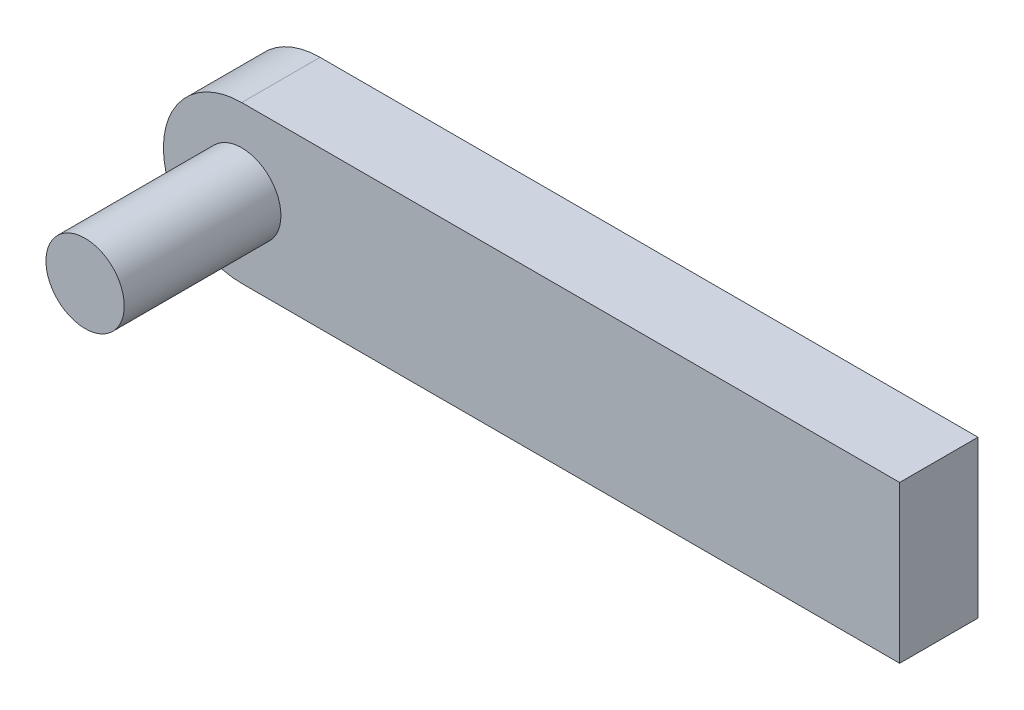
ISO-10303-21;
HEADER;
FILE_DESCRIPTION(('STEP AP214'),'2;1');
FILE_NAME('part.step','',(''),(''),'','','');
FILE_SCHEMA(('AUTOMOTIVE_DESIGN { 1 0 10303 214 1 1 1 1 }'));
ENDSEC;
DATA;
#1=APPLICATION_CONTEXT('core data for automotive mechanical design processes');
#2=APPLICATION_PROTOCOL_DEFINITION('international standard','automotive_design',2000,#1);
#3=PRODUCT_CONTEXT('',#1,'mechanical');
#4=PRODUCT('Part','Part','',(#3));
#5=PRODUCT_RELATED_PRODUCT_CATEGORY('part','',(#4));
#6=PRODUCT_DEFINITION_FORMATION('','',#4);
#7=PRODUCT_DEFINITION_CONTEXT('part definition',#1,'design');
#8=PRODUCT_DEFINITION('design','',#6,#7);
#9=PRODUCT_DEFINITION_SHAPE('','',#8);
#10=(LENGTH_UNIT() NAMED_UNIT(*) SI_UNIT(.MILLI.,.METRE.));
#11=(NAMED_UNIT(*) PLANE_ANGLE_UNIT() SI_UNIT($,.RADIAN.));
#12=(NAMED_UNIT(*) SI_UNIT($,.STERADIAN.) SOLID_ANGLE_UNIT());
#13=UNCERTAINTY_MEASURE_WITH_UNIT(LENGTH_MEASURE(1.E-05),#10,'distance_accuracy_value','');
#14=(GEOMETRIC_REPRESENTATION_CONTEXT(3) GLOBAL_UNCERTAINTY_ASSIGNED_CONTEXT((#13)) GLOBAL_UNIT_ASSIGNED_CONTEXT((#10,
#11,#12)) REPRESENTATION_CONTEXT('',''));
#15=CARTESIAN_POINT('',(0.,0.,0.));
#16=DIRECTION('',(0.,0.,1.));
#17=DIRECTION('',(1.,0.,0.));
#18=AXIS2_PLACEMENT_3D('',#15,#16,#17);
#19=CARTESIAN_POINT('',(0.,0.,10.));
#20=DIRECTION('',(0.,0.,-1.));
#21=DIRECTION('',(-1.,0.,0.));
#22=AXIS2_PLACEMENT_3D('',#19,#20,#21);
#23=CYLINDRICAL_SURFACE('',#22,2.5);
#24=CARTESIAN_POINT('',(0.,0.,10.));
#25=DIRECTION('',(0.,0.,1.));
#26=DIRECTION('',(1.,0.,0.));
#27=AXIS2_PLACEMENT_3D('',#24,#25,#26);
#28=CIRCLE('',#27,2.5);
#29=CARTESIAN_POINT('',(2.5,0.,10.));
#30=VERTEX_POINT('',#29);
#31=EDGE_CURVE('E11',#30,#30,#28,.T.);
#32=ORIENTED_EDGE('',*,*,#31,.F.);
#33=EDGE_LOOP('',(#32));
#34=FACE_BOUND('',#33,.T.);
#35=CARTESIAN_POINT('',(0.,0.,0.));
#36=DIRECTION('',(0.,0.,1.));
#37=DIRECTION('',(1.,0.,0.));
#38=AXIS2_PLACEMENT_3D('',#35,#36,#37);
#39=CIRCLE('',#38,2.5);
#40=CARTESIAN_POINT('',(2.5,0.,0.));
#41=VERTEX_POINT('',#40);
#42=EDGE_CURVE('E42',#41,#41,#39,.T.);
#43=ORIENTED_EDGE('',*,*,#42,.T.);
#44=EDGE_LOOP('',(#43));
#45=FACE_BOUND('',#44,.T.);
#46=ADVANCED_FACE('F39',(#34,#45),#23,.T.);
#47=CARTESIAN_POINT('',(0.,0.,10.));
#48=DIRECTION('',(0.,0.,1.));
#49=DIRECTION('',(1.,0.,0.));
#50=AXIS2_PLACEMENT_3D('',#47,#48,#49);
#51=PLANE('',#50);
#52=ORIENTED_EDGE('',*,*,#31,.T.);
#53=EDGE_LOOP('',(#52));
#54=FACE_BOUND('',#53,.T.);
#55=ADVANCED_FACE('F141',(#54),#51,.T.);
#56=CARTESIAN_POINT('',(0.,0.,-5.));
#57=DIRECTION('',(0.,0.,1.));
#58=DIRECTION('',(1.,0.,0.));
#59=AXIS2_PLACEMENT_3D('',#56,#57,#58);
#60=CYLINDRICAL_SURFACE('',#59,5.);
#61=CARTESIAN_POINT('',(0.,0.,-5.));
#62=DIRECTION('',(0.,0.,-1.));
#63=DIRECTION('',(-1.,0.,0.));
#64=AXIS2_PLACEMENT_3D('',#61,#62,#63);
#65=CIRCLE('',#64,5.);
#66=CARTESIAN_POINT('',(0.,-5.,-5.));
#67=VERTEX_POINT('',#66);
#68=CARTESIAN_POINT('',(0.,5.,-5.));
#69=VERTEX_POINT('',#68);
#70=EDGE_CURVE('E54',#67,#69,#65,.T.);
#71=ORIENTED_EDGE('',*,*,#70,.F.);
#72=DIRECTION('',(0.,0.,1.));
#73=VECTOR('',#72,1.);
#74=CARTESIAN_POINT('',(0.,-5.,-5.));
#75=LINE('',#74,#73);
#76=CARTESIAN_POINT('',(0.,-5.,0.));
#77=VERTEX_POINT('',#76);
#78=EDGE_CURVE('E113',#77,#67,#75,.F.);
#79=ORIENTED_EDGE('',*,*,#78,.F.);
#80=CARTESIAN_POINT('',(0.,0.,0.));
#81=DIRECTION('',(0.,0.,-1.));
#82=DIRECTION('',(-1.,0.,0.));
#83=AXIS2_PLACEMENT_3D('',#80,#81,#82);
#84=CIRCLE('',#83,5.);
#85=CARTESIAN_POINT('',(0.,5.,0.));
#86=VERTEX_POINT('',#85);
#87=EDGE_CURVE('E85',#77,#86,#84,.T.);
#88=ORIENTED_EDGE('',*,*,#87,.T.);
#89=DIRECTION('',(0.,0.,1.));
#90=VECTOR('',#89,1.);
#91=CARTESIAN_POINT('',(0.,5.,-5.));
#92=LINE('',#91,#90);
#93=EDGE_CURVE('E59',#86,#69,#92,.F.);
#94=ORIENTED_EDGE('',*,*,#93,.T.);
#95=EDGE_LOOP('',(#71,#79,#88,#94));
#96=FACE_BOUND('',#95,.T.);
#97=ADVANCED_FACE('F127',(#96),#60,.T.);
#98=CARTESIAN_POINT('',(0.,0.,-5.));
#99=DIRECTION('',(0.,0.,-1.));
#100=DIRECTION('',(-1.,0.,0.));
#101=AXIS2_PLACEMENT_3D('',#98,#99,#100);
#102=PLANE('',#101);
#103=ORIENTED_EDGE('',*,*,#70,.T.);
#104=DIRECTION('',(1.,0.,0.));
#105=VECTOR('',#104,1.);
#106=CARTESIAN_POINT('',(-5.001,5.,-5.));
#107=LINE('',#106,#105);
#108=CARTESIAN_POINT('',(42.,5.,-5.));
#109=VERTEX_POINT('',#108);
#110=EDGE_CURVE('E117',#69,#109,#107,.T.);
#111=ORIENTED_EDGE('',*,*,#110,.T.);
#112=DIRECTION('',(0.,1.,0.));
#113=VECTOR('',#112,1.);
#114=CARTESIAN_POINT('',(42.,5.,-5.));
#115=LINE('',#114,#113);
#116=CARTESIAN_POINT('',(42.,-5.,-5.));
#117=VERTEX_POINT('',#116);
#118=EDGE_CURVE('E99',#117,#109,#115,.T.);
#119=ORIENTED_EDGE('',*,*,#118,.F.);
#120=DIRECTION('',(1.,0.,0.));
#121=VECTOR('',#120,1.);
#122=CARTESIAN_POINT('',(-5.001,-5.,-5.));
#123=LINE('',#122,#121);
#124=EDGE_CURVE('E89',#67,#117,#123,.T.);
#125=ORIENTED_EDGE('',*,*,#124,.F.);
#126=EDGE_LOOP('',(#103,#111,#119,#125));
#127=FACE_BOUND('',#126,.T.);
#128=ADVANCED_FACE('F132',(#127),#102,.T.);
#129=CARTESIAN_POINT('',(0.,0.,0.));
#130=DIRECTION('',(0.,0.,-1.));
#131=DIRECTION('',(-1.,0.,0.));
#132=AXIS2_PLACEMENT_3D('',#129,#130,#131);
#133=PLANE('',#132);
#134=ORIENTED_EDGE('',*,*,#42,.F.);
#135=EDGE_LOOP('',(#134));
#136=FACE_BOUND('',#135,.T.);
#137=ORIENTED_EDGE('',*,*,#87,.F.);
#138=DIRECTION('',(1.,0.,0.));
#139=VECTOR('',#138,1.);
#140=CARTESIAN_POINT('',(-5.001,-5.,0.));
#141=LINE('',#140,#139);
#142=CARTESIAN_POINT('',(42.,-5.,0.));
#143=VERTEX_POINT('',#142);
#144=EDGE_CURVE('E79',#77,#143,#141,.T.);
#145=ORIENTED_EDGE('',*,*,#144,.T.);
#146=DIRECTION('',(0.,-1.,0.));
#147=VECTOR('',#146,1.);
#148=CARTESIAN_POINT('',(42.,5.,0.));
#149=LINE('',#148,#147);
#150=CARTESIAN_POINT('',(42.,5.,0.));
#151=VERTEX_POINT('',#150);
#152=EDGE_CURVE('E84',#151,#143,#149,.T.);
#153=ORIENTED_EDGE('',*,*,#152,.F.);
#154=DIRECTION('',(1.,0.,0.));
#155=VECTOR('',#154,1.);
#156=CARTESIAN_POINT('',(-5.001,5.,0.));
#157=LINE('',#156,#155);
#158=EDGE_CURVE('E114',#86,#151,#157,.T.);
#159=ORIENTED_EDGE('',*,*,#158,.F.);
#160=EDGE_LOOP('',(#137,#145,#153,#159));
#161=FACE_BOUND('',#160,.T.);
#162=ADVANCED_FACE('F81',(#136,#161),#133,.F.);
#163=CARTESIAN_POINT('',(-5.001,-5.,0.));
#164=DIRECTION('',(0.,-1.,0.));
#165=DIRECTION('',(0.,0.,-1.));
#166=AXIS2_PLACEMENT_3D('',#163,#164,#165);
#167=PLANE('',#166);
#168=ORIENTED_EDGE('',*,*,#144,.F.);
#169=ORIENTED_EDGE('',*,*,#78,.T.);
#170=ORIENTED_EDGE('',*,*,#124,.T.);
#171=DIRECTION('',(0.,0.,-1.));
#172=VECTOR('',#171,1.);
#173=CARTESIAN_POINT('',(42.,-5.,0.));
#174=LINE('',#173,#172);
#175=EDGE_CURVE('E93',#143,#117,#174,.T.);
#176=ORIENTED_EDGE('',*,*,#175,.F.);
#177=EDGE_LOOP('',(#168,#169,#170,#176));
#178=FACE_BOUND('',#177,.T.);
#179=ADVANCED_FACE('F94',(#178),#167,.T.);
#180=CARTESIAN_POINT('',(-5.001,5.,0.));
#181=DIRECTION('',(0.,1.,0.));
#182=DIRECTION('',(0.,0.,1.));
#183=AXIS2_PLACEMENT_3D('',#180,#181,#182);
#184=PLANE('',#183);
#185=ORIENTED_EDGE('',*,*,#93,.F.);
#186=ORIENTED_EDGE('',*,*,#158,.T.);
#187=DIRECTION('',(0.,0.,1.));
#188=VECTOR('',#187,1.);
#189=CARTESIAN_POINT('',(42.,5.,0.));
#190=LINE('',#189,#188);
#191=EDGE_CURVE('E90',#109,#151,#190,.T.);
#192=ORIENTED_EDGE('',*,*,#191,.F.);
#193=ORIENTED_EDGE('',*,*,#110,.F.);
#194=EDGE_LOOP('',(#185,#186,#192,#193));
#195=FACE_BOUND('',#194,.T.);
#196=ADVANCED_FACE('F130',(#195),#184,.T.);
#197=CARTESIAN_POINT('',(42.,0.,0.));
#198=DIRECTION('',(1.,0.,0.));
#199=DIRECTION('',(0.,0.,-1.));
#200=AXIS2_PLACEMENT_3D('',#197,#198,#199);
#201=PLANE('',#200);
#202=ORIENTED_EDGE('',*,*,#152,.T.);
#203=ORIENTED_EDGE('',*,*,#175,.T.);
#204=ORIENTED_EDGE('',*,*,#118,.T.);
#205=ORIENTED_EDGE('',*,*,#191,.T.);
#206=EDGE_LOOP('',(#202,#203,#204,#205));
#207=FACE_BOUND('',#206,.T.);
#208=ADVANCED_FACE('F102',(#207),#201,.T.);
#209=CLOSED_SHELL('',(#46,#55,#97,#128,#162,#179,#196,#208));
#210=MANIFOLD_SOLID_BREP('B2',#209);
#211=ADVANCED_BREP_SHAPE_REPRESENTATION('',(#18,#210),#14);
#212=SHAPE_DEFINITION_REPRESENTATION(#9,#211);
ENDSEC;
END-ISO-10303-21;
